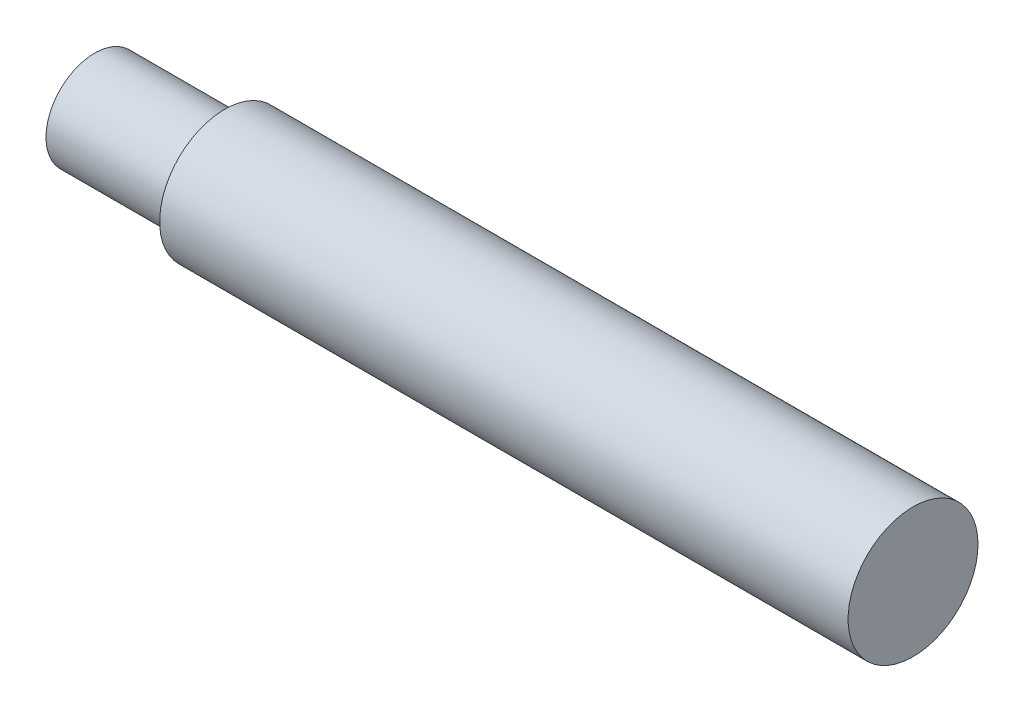
ISO-10303-21;
HEADER;
FILE_DESCRIPTION(('STEP AP214'),'2;1');
FILE_NAME('part.step','',(''),(''),'','','');
FILE_SCHEMA(('AUTOMOTIVE_DESIGN { 1 0 10303 214 1 1 1 1 }'));
ENDSEC;
DATA;
#1=APPLICATION_CONTEXT('core data for automotive mechanical design processes');
#2=APPLICATION_PROTOCOL_DEFINITION('international standard','automotive_design',2000,#1);
#3=PRODUCT_CONTEXT('',#1,'mechanical');
#4=PRODUCT('Part','Part','',(#3));
#5=PRODUCT_RELATED_PRODUCT_CATEGORY('part','',(#4));
#6=PRODUCT_DEFINITION_FORMATION('','',#4);
#7=PRODUCT_DEFINITION_CONTEXT('part definition',#1,'design');
#8=PRODUCT_DEFINITION('design','',#6,#7);
#9=PRODUCT_DEFINITION_SHAPE('','',#8);
#10=(LENGTH_UNIT() NAMED_UNIT(*) SI_UNIT(.MILLI.,.METRE.));
#11=(NAMED_UNIT(*) PLANE_ANGLE_UNIT() SI_UNIT($,.RADIAN.));
#12=(NAMED_UNIT(*) SI_UNIT($,.STERADIAN.) SOLID_ANGLE_UNIT());
#13=UNCERTAINTY_MEASURE_WITH_UNIT(LENGTH_MEASURE(1.E-05),#10,'distance_accuracy_value','');
#14=(GEOMETRIC_REPRESENTATION_CONTEXT(3) GLOBAL_UNCERTAINTY_ASSIGNED_CONTEXT((#13)) GLOBAL_UNIT_ASSIGNED_CONTEXT((#10,
#11,#12)) REPRESENTATION_CONTEXT('',''));
#15=CARTESIAN_POINT('',(0.,0.,0.));
#16=DIRECTION('',(0.,0.,1.));
#17=DIRECTION('',(1.,0.,0.));
#18=AXIS2_PLACEMENT_3D('',#15,#16,#17);
#19=CARTESIAN_POINT('',(106.,0.,0.));
#20=DIRECTION('',(-1.,0.,0.));
#21=DIRECTION('',(0.,0.,1.));
#22=AXIS2_PLACEMENT_3D('',#19,#20,#21);
#23=CYLINDRICAL_SURFACE('',#22,10.);
#24=CARTESIAN_POINT('',(106.,0.,0.));
#25=DIRECTION('',(1.,0.,0.));
#26=DIRECTION('',(0.,0.,-1.));
#27=AXIS2_PLACEMENT_3D('',#24,#25,#26);
#28=CIRCLE('',#27,10.);
#29=CARTESIAN_POINT('',(106.,0.,-10.));
#30=VERTEX_POINT('',#29);
#31=EDGE_CURVE('E38',#30,#30,#28,.T.);
#32=ORIENTED_EDGE('',*,*,#31,.F.);
#33=EDGE_LOOP('',(#32));
#34=FACE_BOUND('',#33,.T.);
#35=CARTESIAN_POINT('',(0.,0.,0.));
#36=DIRECTION('',(1.,0.,0.));
#37=DIRECTION('',(0.,0.,-1.));
#38=AXIS2_PLACEMENT_3D('',#35,#36,#37);
#39=CIRCLE('',#38,10.);
#40=CARTESIAN_POINT('',(0.,0.,-10.));
#41=VERTEX_POINT('',#40);
#42=EDGE_CURVE('E34',#41,#41,#39,.T.);
#43=ORIENTED_EDGE('',*,*,#42,.T.);
#44=EDGE_LOOP('',(#43));
#45=FACE_BOUND('',#44,.T.);
#46=ADVANCED_FACE('F31',(#34,#45),#23,.T.);
#47=CARTESIAN_POINT('',(106.,0.,0.));
#48=DIRECTION('',(1.,0.,0.));
#49=DIRECTION('',(0.,0.,-1.));
#50=AXIS2_PLACEMENT_3D('',#47,#48,#49);
#51=PLANE('',#50);
#52=ORIENTED_EDGE('',*,*,#31,.T.);
#53=EDGE_LOOP('',(#52));
#54=FACE_BOUND('',#53,.T.);
#55=ADVANCED_FACE('F55',(#54),#51,.T.);
#56=CARTESIAN_POINT('',(0.,0.,0.));
#57=DIRECTION('',(1.,0.,0.));
#58=DIRECTION('',(0.,0.,-1.));
#59=AXIS2_PLACEMENT_3D('',#56,#57,#58);
#60=PLANE('',#59);
#61=CARTESIAN_POINT('',(0.,0.,0.));
#62=DIRECTION('',(-1.,0.,0.));
#63=DIRECTION('',(0.,0.,1.));
#64=AXIS2_PLACEMENT_3D('',#61,#62,#63);
#65=CIRCLE('',#64,7.5);
#66=CARTESIAN_POINT('',(0.,0.,7.5));
#67=VERTEX_POINT('',#66);
#68=EDGE_CURVE('E10',#67,#67,#65,.T.);
#69=ORIENTED_EDGE('',*,*,#68,.F.);
#70=EDGE_LOOP('',(#69));
#71=FACE_BOUND('',#70,.T.);
#72=ORIENTED_EDGE('',*,*,#42,.F.);
#73=EDGE_LOOP('',(#72));
#74=FACE_BOUND('',#73,.T.);
#75=ADVANCED_FACE('F52',(#71,#74),#60,.F.);
#76=CARTESIAN_POINT('',(-20.,0.,0.));
#77=DIRECTION('',(1.,0.,0.));
#78=DIRECTION('',(0.,0.,-1.));
#79=AXIS2_PLACEMENT_3D('',#76,#77,#78);
#80=CYLINDRICAL_SURFACE('',#79,7.5);
#81=CARTESIAN_POINT('',(-20.,0.,0.));
#82=DIRECTION('',(-1.,0.,0.));
#83=DIRECTION('',(0.,0.,1.));
#84=AXIS2_PLACEMENT_3D('',#81,#82,#83);
#85=CIRCLE('',#84,7.5);
#86=CARTESIAN_POINT('',(-20.,0.,7.5));
#87=VERTEX_POINT('',#86);
#88=EDGE_CURVE('E44',#87,#87,#85,.T.);
#89=ORIENTED_EDGE('',*,*,#88,.F.);
#90=EDGE_LOOP('',(#89));
#91=FACE_BOUND('',#90,.T.);
#92=ORIENTED_EDGE('',*,*,#68,.T.);
#93=EDGE_LOOP('',(#92));
#94=FACE_BOUND('',#93,.T.);
#95=ADVANCED_FACE('F54',(#91,#94),#80,.T.);
#96=CARTESIAN_POINT('',(-20.,0.,0.));
#97=DIRECTION('',(-1.,0.,0.));
#98=DIRECTION('',(0.,0.,1.));
#99=AXIS2_PLACEMENT_3D('',#96,#97,#98);
#100=PLANE('',#99);
#101=ORIENTED_EDGE('',*,*,#88,.T.);
#102=EDGE_LOOP('',(#101));
#103=FACE_BOUND('',#102,.T.);
#104=ADVANCED_FACE('F61',(#103),#100,.T.);
#105=CLOSED_SHELL('',(#46,#55,#75,#95,#104));
#106=MANIFOLD_SOLID_BREP('B2',#105);
#107=ADVANCED_BREP_SHAPE_REPRESENTATION('',(#18,#106),#14);
#108=SHAPE_DEFINITION_REPRESENTATION(#9,#107);
ENDSEC;
END-ISO-10303-21;
